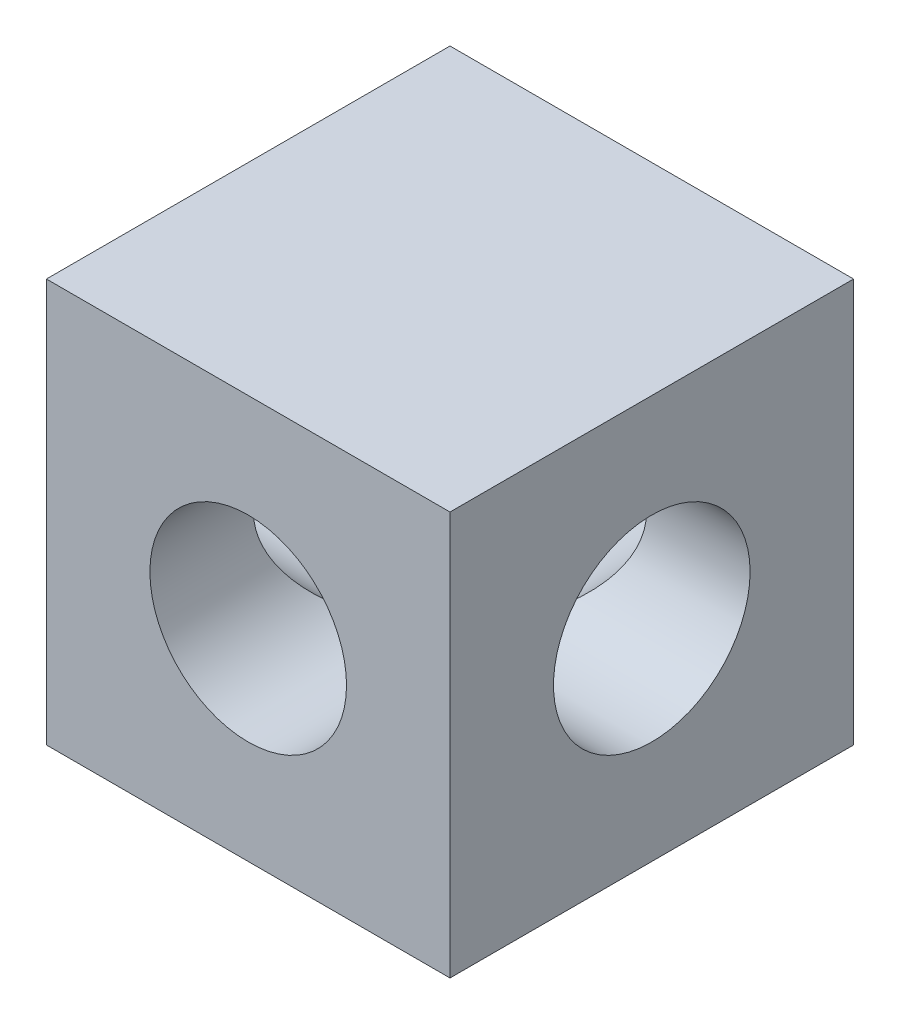
ISO-10303-21;
HEADER;
FILE_DESCRIPTION(('STEP AP214'),'2;1');
FILE_NAME('part.step','',(''),(''),'','','');
FILE_SCHEMA(('AUTOMOTIVE_DESIGN { 1 0 10303 214 1 1 1 1 }'));
ENDSEC;
DATA;
#1=APPLICATION_CONTEXT('core data for automotive mechanical design processes');
#2=APPLICATION_PROTOCOL_DEFINITION('international standard','automotive_design',2000,#1);
#3=PRODUCT_CONTEXT('',#1,'mechanical');
#4=PRODUCT('Part','Part','',(#3));
#5=PRODUCT_RELATED_PRODUCT_CATEGORY('part','',(#4));
#6=PRODUCT_DEFINITION_FORMATION('','',#4);
#7=PRODUCT_DEFINITION_CONTEXT('part definition',#1,'design');
#8=PRODUCT_DEFINITION('design','',#6,#7);
#9=PRODUCT_DEFINITION_SHAPE('','',#8);
#10=(LENGTH_UNIT() NAMED_UNIT(*) SI_UNIT(.MILLI.,.METRE.));
#11=(NAMED_UNIT(*) PLANE_ANGLE_UNIT() SI_UNIT($,.RADIAN.));
#12=(NAMED_UNIT(*) SI_UNIT($,.STERADIAN.) SOLID_ANGLE_UNIT());
#13=UNCERTAINTY_MEASURE_WITH_UNIT(LENGTH_MEASURE(1.E-05),#10,'distance_accuracy_value','');
#14=(GEOMETRIC_REPRESENTATION_CONTEXT(3) GLOBAL_UNCERTAINTY_ASSIGNED_CONTEXT((#13)) GLOBAL_UNIT_ASSIGNED_CONTEXT((#10,
#11,#12)) REPRESENTATION_CONTEXT('',''));
#15=CARTESIAN_POINT('',(0.,0.,0.));
#16=DIRECTION('',(0.,0.,1.));
#17=DIRECTION('',(1.,0.,0.));
#18=AXIS2_PLACEMENT_3D('',#15,#16,#17);
#19=CARTESIAN_POINT('',(0.,0.,9.75));
#20=DIRECTION('',(0.,0.,-1.));
#21=DIRECTION('',(-1.,0.,0.));
#22=AXIS2_PLACEMENT_3D('',#19,#20,#21);
#23=CYLINDRICAL_SURFACE('',#22,4.75);
#24=CARTESIAN_POINT('',(0.,0.,0.));
#25=DIRECTION('',(0.707106781186547,0.,-0.707106781186547));
#26=DIRECTION('',(-0.707106781186547,0.,-0.707106781186547));
#27=AXIS2_PLACEMENT_3D('',#24,#25,#26);
#28=ELLIPSE('',#27,6.7175144212722,4.75);
#29=CARTESIAN_POINT('',(0.,-4.75,0.));
#30=VERTEX_POINT('',#29);
#31=CARTESIAN_POINT('',(0.,4.75,0.));
#32=VERTEX_POINT('',#31);
#33=EDGE_CURVE('E11',#30,#32,#28,.F.);
#34=ORIENTED_EDGE('',*,*,#33,.F.);
#35=CARTESIAN_POINT('',(0.,0.,0.));
#36=DIRECTION('',(-0.707106781186547,0.,-0.707106781186547));
#37=DIRECTION('',(0.707106781186547,0.,-0.707106781186547));
#38=AXIS2_PLACEMENT_3D('',#35,#36,#37);
#39=ELLIPSE('',#38,6.7175144212722,4.75);
#40=EDGE_CURVE('E52',#32,#30,#39,.F.);
#41=ORIENTED_EDGE('',*,*,#40,.F.);
#42=EDGE_LOOP('',(#34,#41));
#43=FACE_BOUND('',#42,.T.);
#44=CARTESIAN_POINT('',(0.,0.,9.75));
#45=DIRECTION('',(0.,0.,1.));
#46=DIRECTION('',(1.,0.,0.));
#47=AXIS2_PLACEMENT_3D('',#44,#45,#46);
#48=CIRCLE('',#47,4.75);
#49=CARTESIAN_POINT('',(4.75,0.,9.75));
#50=VERTEX_POINT('',#49);
#51=EDGE_CURVE('E129',#50,#50,#48,.T.);
#52=ORIENTED_EDGE('',*,*,#51,.T.);
#53=EDGE_LOOP('',(#52));
#54=FACE_BOUND('',#53,.T.);
#55=ADVANCED_FACE('F38',(#43,#54),#23,.F.);
#56=CARTESIAN_POINT('',(-9.75,-9.75,9.75));
#57=DIRECTION('',(0.,0.,-1.));
#58=DIRECTION('',(-1.,0.,0.));
#59=AXIS2_PLACEMENT_3D('',#56,#57,#58);
#60=PLANE('',#59);
#61=DIRECTION('',(0.,1.,0.));
#62=VECTOR('',#61,1.);
#63=CARTESIAN_POINT('',(-9.75,-9.75,9.75));
#64=LINE('',#63,#62);
#65=CARTESIAN_POINT('',(-9.75,-9.75,9.75));
#66=VERTEX_POINT('',#65);
#67=CARTESIAN_POINT('',(-9.75,9.75,9.75));
#68=VERTEX_POINT('',#67);
#69=EDGE_CURVE('E119',#66,#68,#64,.T.);
#70=ORIENTED_EDGE('',*,*,#69,.F.);
#71=DIRECTION('',(1.,0.,0.));
#72=VECTOR('',#71,1.);
#73=CARTESIAN_POINT('',(-9.75,-9.75,9.75));
#74=LINE('',#73,#72);
#75=CARTESIAN_POINT('',(9.75,-9.75,9.75));
#76=VERTEX_POINT('',#75);
#77=EDGE_CURVE('E112',#66,#76,#74,.T.);
#78=ORIENTED_EDGE('',*,*,#77,.T.);
#79=DIRECTION('',(0.,-1.,0.));
#80=VECTOR('',#79,1.);
#81=CARTESIAN_POINT('',(9.75,9.75,9.75));
#82=LINE('',#81,#80);
#83=CARTESIAN_POINT('',(9.75,9.75,9.75));
#84=VERTEX_POINT('',#83);
#85=EDGE_CURVE('E131',#84,#76,#82,.T.);
#86=ORIENTED_EDGE('',*,*,#85,.F.);
#87=DIRECTION('',(-1.,0.,0.));
#88=VECTOR('',#87,1.);
#89=CARTESIAN_POINT('',(9.75,9.75,9.75));
#90=LINE('',#89,#88);
#91=EDGE_CURVE('E88',#84,#68,#90,.T.);
#92=ORIENTED_EDGE('',*,*,#91,.T.);
#93=EDGE_LOOP('',(#70,#78,#86,#92));
#94=FACE_BOUND('',#93,.T.);
#95=ORIENTED_EDGE('',*,*,#51,.F.);
#96=EDGE_LOOP('',(#95));
#97=FACE_BOUND('',#96,.T.);
#98=ADVANCED_FACE('F158',(#94,#97),#60,.F.);
#99=CARTESIAN_POINT('',(-9.75,-9.75,-9.75));
#100=DIRECTION('',(0.,0.,-1.));
#101=DIRECTION('',(-1.,0.,0.));
#102=AXIS2_PLACEMENT_3D('',#99,#100,#101);
#103=PLANE('',#102);
#104=DIRECTION('',(0.,1.,0.));
#105=VECTOR('',#104,1.);
#106=CARTESIAN_POINT('',(-9.75,-9.75,-9.75));
#107=LINE('',#106,#105);
#108=CARTESIAN_POINT('',(-9.75,-9.75,-9.75));
#109=VERTEX_POINT('',#108);
#110=CARTESIAN_POINT('',(-9.75,9.75,-9.75));
#111=VERTEX_POINT('',#110);
#112=EDGE_CURVE('E126',#109,#111,#107,.T.);
#113=ORIENTED_EDGE('',*,*,#112,.T.);
#114=DIRECTION('',(-1.,0.,0.));
#115=VECTOR('',#114,1.);
#116=CARTESIAN_POINT('',(9.75,9.75,-9.75));
#117=LINE('',#116,#115);
#118=CARTESIAN_POINT('',(9.75,9.75,-9.75));
#119=VERTEX_POINT('',#118);
#120=EDGE_CURVE('E123',#119,#111,#117,.T.);
#121=ORIENTED_EDGE('',*,*,#120,.F.);
#122=DIRECTION('',(0.,-1.,0.));
#123=VECTOR('',#122,1.);
#124=CARTESIAN_POINT('',(9.75,9.75,-9.75));
#125=LINE('',#124,#123);
#126=CARTESIAN_POINT('',(9.75,-9.75,-9.75));
#127=VERTEX_POINT('',#126);
#128=EDGE_CURVE('E120',#119,#127,#125,.T.);
#129=ORIENTED_EDGE('',*,*,#128,.T.);
#130=DIRECTION('',(1.,0.,0.));
#131=VECTOR('',#130,1.);
#132=CARTESIAN_POINT('',(-9.75,-9.75,-9.75));
#133=LINE('',#132,#131);
#134=EDGE_CURVE('E117',#109,#127,#133,.T.);
#135=ORIENTED_EDGE('',*,*,#134,.F.);
#136=EDGE_LOOP('',(#113,#121,#129,#135));
#137=FACE_BOUND('',#136,.T.);
#138=CARTESIAN_POINT('',(0.,0.,-9.75));
#139=DIRECTION('',(0.,0.,1.));
#140=DIRECTION('',(1.,0.,0.));
#141=AXIS2_PLACEMENT_3D('',#138,#139,#140);
#142=CIRCLE('',#141,4.75);
#143=CARTESIAN_POINT('',(4.75,0.,-9.75));
#144=VERTEX_POINT('',#143);
#145=EDGE_CURVE('E137',#144,#144,#142,.T.);
#146=ORIENTED_EDGE('',*,*,#145,.T.);
#147=EDGE_LOOP('',(#146));
#148=FACE_BOUND('',#147,.T.);
#149=ADVANCED_FACE('F162',(#137,#148),#103,.T.);
#150=CARTESIAN_POINT('',(-9.75,-9.75,9.75));
#151=DIRECTION('',(-1.,0.,0.));
#152=DIRECTION('',(0.,0.,1.));
#153=AXIS2_PLACEMENT_3D('',#150,#151,#152);
#154=PLANE('',#153);
#155=CARTESIAN_POINT('',(-9.75,0.,0.));
#156=DIRECTION('',(1.,0.,0.));
#157=DIRECTION('',(0.,0.,-1.));
#158=AXIS2_PLACEMENT_3D('',#155,#156,#157);
#159=CIRCLE('',#158,4.75);
#160=CARTESIAN_POINT('',(-9.75,0.,-4.75));
#161=VERTEX_POINT('',#160);
#162=EDGE_CURVE('E140',#161,#161,#159,.T.);
#163=ORIENTED_EDGE('',*,*,#162,.T.);
#164=EDGE_LOOP('',(#163));
#165=FACE_BOUND('',#164,.T.);
#166=ORIENTED_EDGE('',*,*,#112,.F.);
#167=DIRECTION('',(0.,0.,-1.));
#168=VECTOR('',#167,1.);
#169=CARTESIAN_POINT('',(-9.75,-9.75,9.75));
#170=LINE('',#169,#168);
#171=EDGE_CURVE('E61',#66,#109,#170,.T.);
#172=ORIENTED_EDGE('',*,*,#171,.F.);
#173=ORIENTED_EDGE('',*,*,#69,.T.);
#174=DIRECTION('',(0.,0.,-1.));
#175=VECTOR('',#174,1.);
#176=CARTESIAN_POINT('',(-9.75,9.75,9.75));
#177=LINE('',#176,#175);
#178=EDGE_CURVE('E109',#68,#111,#177,.T.);
#179=ORIENTED_EDGE('',*,*,#178,.T.);
#180=EDGE_LOOP('',(#166,#172,#173,#179));
#181=FACE_BOUND('',#180,.T.);
#182=ADVANCED_FACE('F40',(#165,#181),#154,.T.);
#183=CARTESIAN_POINT('',(-9.75,-9.75,9.75));
#184=DIRECTION('',(0.,1.,0.));
#185=DIRECTION('',(0.,0.,1.));
#186=AXIS2_PLACEMENT_3D('',#183,#184,#185);
#187=PLANE('',#186);
#188=ORIENTED_EDGE('',*,*,#134,.T.);
#189=DIRECTION('',(0.,0.,-1.));
#190=VECTOR('',#189,1.);
#191=CARTESIAN_POINT('',(9.75,-9.75,9.75));
#192=LINE('',#191,#190);
#193=EDGE_CURVE('E114',#76,#127,#192,.T.);
#194=ORIENTED_EDGE('',*,*,#193,.F.);
#195=ORIENTED_EDGE('',*,*,#77,.F.);
#196=ORIENTED_EDGE('',*,*,#171,.T.);
#197=EDGE_LOOP('',(#188,#194,#195,#196));
#198=FACE_BOUND('',#197,.T.);
#199=ADVANCED_FACE('F168',(#198),#187,.F.);
#200=CARTESIAN_POINT('',(9.75,9.75,9.75));
#201=DIRECTION('',(1.,0.,0.));
#202=DIRECTION('',(0.,1.,0.));
#203=AXIS2_PLACEMENT_3D('',#200,#201,#202);
#204=PLANE('',#203);
#205=CARTESIAN_POINT('',(9.75,0.,0.));
#206=DIRECTION('',(1.,0.,0.));
#207=DIRECTION('',(0.,0.,-1.));
#208=AXIS2_PLACEMENT_3D('',#205,#206,#207);
#209=CIRCLE('',#208,4.75);
#210=CARTESIAN_POINT('',(9.75,0.,-4.75));
#211=VERTEX_POINT('',#210);
#212=EDGE_CURVE('E143',#211,#211,#209,.T.);
#213=ORIENTED_EDGE('',*,*,#212,.F.);
#214=EDGE_LOOP('',(#213));
#215=FACE_BOUND('',#214,.T.);
#216=ORIENTED_EDGE('',*,*,#128,.F.);
#217=DIRECTION('',(0.,0.,-1.));
#218=VECTOR('',#217,1.);
#219=CARTESIAN_POINT('',(9.75,9.75,9.75));
#220=LINE('',#219,#218);
#221=EDGE_CURVE('E111',#84,#119,#220,.T.);
#222=ORIENTED_EDGE('',*,*,#221,.F.);
#223=ORIENTED_EDGE('',*,*,#85,.T.);
#224=ORIENTED_EDGE('',*,*,#193,.T.);
#225=EDGE_LOOP('',(#216,#222,#223,#224));
#226=FACE_BOUND('',#225,.T.);
#227=ADVANCED_FACE('F171',(#215,#226),#204,.T.);
#228=CARTESIAN_POINT('',(9.75,9.75,9.75));
#229=DIRECTION('',(0.,-1.,0.));
#230=DIRECTION('',(1.,0.,0.));
#231=AXIS2_PLACEMENT_3D('',#228,#229,#230);
#232=PLANE('',#231);
#233=ORIENTED_EDGE('',*,*,#120,.T.);
#234=ORIENTED_EDGE('',*,*,#178,.F.);
#235=ORIENTED_EDGE('',*,*,#91,.F.);
#236=ORIENTED_EDGE('',*,*,#221,.T.);
#237=EDGE_LOOP('',(#233,#234,#235,#236));
#238=FACE_BOUND('',#237,.T.);
#239=ADVANCED_FACE('F155',(#238),#232,.F.);
#240=CARTESIAN_POINT('',(0.,0.,0.));
#241=DIRECTION('',(0.707106781186547,0.,-0.707106781186547));
#242=DIRECTION('',(-0.707106781186547,0.,-0.707106781186547));
#243=AXIS2_PLACEMENT_3D('',#240,#241,#242);
#244=ELLIPSE('',#243,6.7175144212722,4.75);
#245=EDGE_CURVE('E46',#30,#32,#244,.T.);
#246=ORIENTED_EDGE('',*,*,#245,.F.);
#247=CARTESIAN_POINT('',(0.,0.,0.));
#248=DIRECTION('',(-0.707106781186547,0.,-0.707106781186547));
#249=DIRECTION('',(0.707106781186547,0.,-0.707106781186547));
#250=AXIS2_PLACEMENT_3D('',#247,#248,#249);
#251=ELLIPSE('',#250,6.7175144212722,4.75);
#252=EDGE_CURVE('E95',#32,#30,#251,.T.);
#253=ORIENTED_EDGE('',*,*,#252,.F.);
#254=EDGE_LOOP('',(#246,#253));
#255=FACE_BOUND('',#254,.T.);
#256=ORIENTED_EDGE('',*,*,#145,.F.);
#257=EDGE_LOOP('',(#256));
#258=FACE_BOUND('',#257,.T.);
#259=ADVANCED_FACE('F106',(#255,#258),#23,.F.);
#260=CARTESIAN_POINT('',(-9.75,0.,0.));
#261=DIRECTION('',(1.,0.,0.));
#262=DIRECTION('',(0.,0.,-1.));
#263=AXIS2_PLACEMENT_3D('',#260,#261,#262);
#264=CYLINDRICAL_SURFACE('',#263,4.75);
#265=ORIENTED_EDGE('',*,*,#245,.T.);
#266=ORIENTED_EDGE('',*,*,#40,.T.);
#267=EDGE_LOOP('',(#265,#266));
#268=FACE_BOUND('',#267,.T.);
#269=ORIENTED_EDGE('',*,*,#162,.F.);
#270=EDGE_LOOP('',(#269));
#271=FACE_BOUND('',#270,.T.);
#272=ADVANCED_FACE('F102',(#268,#271),#264,.F.);
#273=ORIENTED_EDGE('',*,*,#33,.T.);
#274=ORIENTED_EDGE('',*,*,#252,.T.);
#275=EDGE_LOOP('',(#273,#274));
#276=FACE_BOUND('',#275,.T.);
#277=ORIENTED_EDGE('',*,*,#212,.T.);
#278=EDGE_LOOP('',(#277));
#279=FACE_BOUND('',#278,.T.);
#280=ADVANCED_FACE('F96',(#276,#279),#264,.F.);
#281=CLOSED_SHELL('',(#55,#98,#149,#182,#199,#227,#239,#259,#272,#280));
#282=MANIFOLD_SOLID_BREP('B2',#281);
#283=ADVANCED_BREP_SHAPE_REPRESENTATION('',(#18,#282),#14);
#284=SHAPE_DEFINITION_REPRESENTATION(#9,#283);
ENDSEC;
END-ISO-10303-21;
